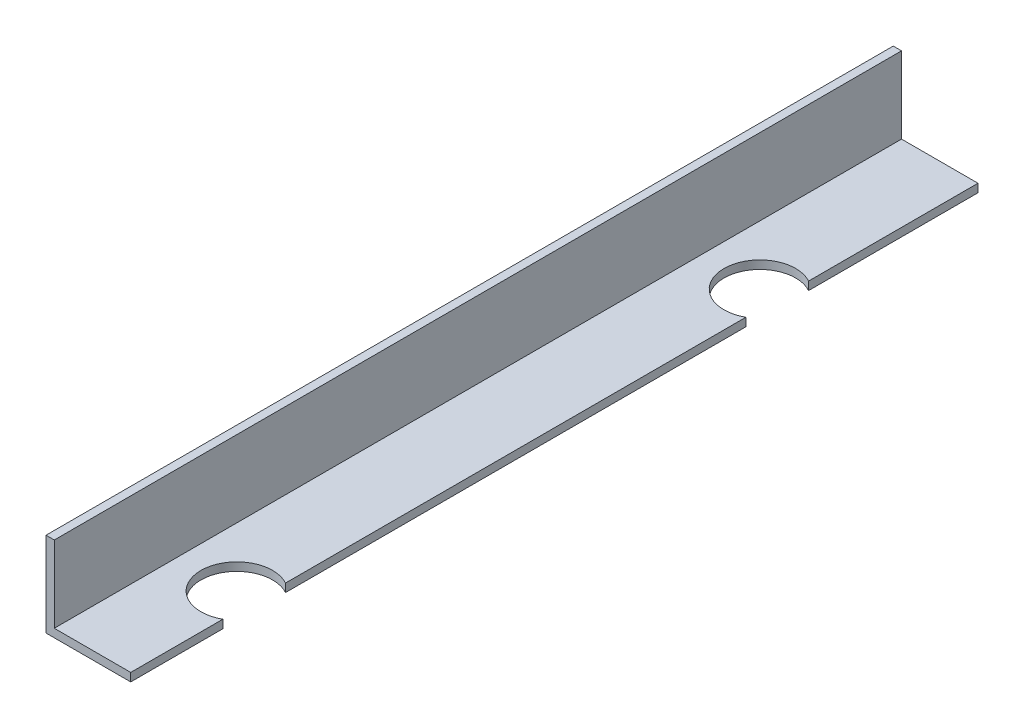
ISO-10303-21;
HEADER;
FILE_DESCRIPTION(('STEP AP214'),'2;1');
FILE_NAME('part.step','',(''),(''),'','','');
FILE_SCHEMA(('AUTOMOTIVE_DESIGN { 1 0 10303 214 1 1 1 1 }'));
ENDSEC;
DATA;
#1=APPLICATION_CONTEXT('core data for automotive mechanical design processes');
#2=APPLICATION_PROTOCOL_DEFINITION('international standard','automotive_design',2000,#1);
#3=PRODUCT_CONTEXT('',#1,'mechanical');
#4=PRODUCT('Part','Part','',(#3));
#5=PRODUCT_RELATED_PRODUCT_CATEGORY('part','',(#4));
#6=PRODUCT_DEFINITION_FORMATION('','',#4);
#7=PRODUCT_DEFINITION_CONTEXT('part definition',#1,'design');
#8=PRODUCT_DEFINITION('design','',#6,#7);
#9=PRODUCT_DEFINITION_SHAPE('','',#8);
#10=(LENGTH_UNIT() NAMED_UNIT(*) SI_UNIT(.MILLI.,.METRE.));
#11=(NAMED_UNIT(*) PLANE_ANGLE_UNIT() SI_UNIT($,.RADIAN.));
#12=(NAMED_UNIT(*) SI_UNIT($,.STERADIAN.) SOLID_ANGLE_UNIT());
#13=UNCERTAINTY_MEASURE_WITH_UNIT(LENGTH_MEASURE(1.E-05),#10,'distance_accuracy_value','');
#14=(GEOMETRIC_REPRESENTATION_CONTEXT(3) GLOBAL_UNCERTAINTY_ASSIGNED_CONTEXT((#13)) GLOBAL_UNIT_ASSIGNED_CONTEXT((#10,
#11,#12)) REPRESENTATION_CONTEXT('',''));
#15=CARTESIAN_POINT('',(0.,0.,0.));
#16=DIRECTION('',(0.,0.,1.));
#17=DIRECTION('',(1.,0.,0.));
#18=AXIS2_PLACEMENT_3D('',#15,#16,#17);
#19=CARTESIAN_POINT('',(65.,0.,325.));
#20=DIRECTION('',(-1.,0.,0.));
#21=DIRECTION('',(0.,0.,1.));
#22=AXIS2_PLACEMENT_3D('',#19,#20,#21);
#23=PLANE('',#22);
#24=DIRECTION('',(0.,0.,-1.));
#25=VECTOR('',#24,1.);
#26=CARTESIAN_POINT('',(65.,0.,325.));
#27=LINE('',#26,#25);
#28=CARTESIAN_POINT('',(65.,0.,206.240418334901));
#29=VERTEX_POINT('',#28);
#30=CARTESIAN_POINT('',(65.,0.,-146.890547328554));
#31=VERTEX_POINT('',#30);
#32=EDGE_CURVE('E120',#29,#31,#27,.T.);
#33=ORIENTED_EDGE('',*,*,#32,.T.);
#34=DIRECTION('',(0.,1.,0.));
#35=VECTOR('',#34,1.);
#36=CARTESIAN_POINT('',(65.,-3.64999999999981,-146.890547328554));
#37=LINE('',#36,#35);
#38=CARTESIAN_POINT('',(65.,6.35000000000019,-146.890547328554));
#39=VERTEX_POINT('',#38);
#40=EDGE_CURVE('E110',#31,#39,#37,.T.);
#41=ORIENTED_EDGE('',*,*,#40,.T.);
#42=DIRECTION('',(0.,0.,-1.));
#43=VECTOR('',#42,1.);
#44=CARTESIAN_POINT('',(65.,6.35,325.));
#45=LINE('',#44,#43);
#46=CARTESIAN_POINT('',(65.,6.35,206.240418334901));
#47=VERTEX_POINT('',#46);
#48=EDGE_CURVE('E118',#47,#39,#45,.T.);
#49=ORIENTED_EDGE('',*,*,#48,.F.);
#50=DIRECTION('',(0.,1.,0.));
#51=VECTOR('',#50,1.);
#52=CARTESIAN_POINT('',(65.,-3.65000000000015,206.240418334901));
#53=LINE('',#52,#51);
#54=EDGE_CURVE('E57',#47,#29,#53,.F.);
#55=ORIENTED_EDGE('',*,*,#54,.T.);
#56=EDGE_LOOP('',(#33,#41,#49,#55));
#57=FACE_BOUND('',#56,.T.);
#58=ADVANCED_FACE('F35',(#57),#23,.F.);
#59=CARTESIAN_POINT('',(65.,0.,325.));
#60=VERTEX_POINT('',#59);
#61=CARTESIAN_POINT('',(65.,0.,254.339777591017));
#62=VERTEX_POINT('',#61);
#63=EDGE_CURVE('E133',#60,#62,#27,.T.);
#64=ORIENTED_EDGE('',*,*,#63,.T.);
#65=DIRECTION('',(0.,1.,0.));
#66=VECTOR('',#65,1.);
#67=CARTESIAN_POINT('',(65.,-3.65000000000015,254.339777591017));
#68=LINE('',#67,#66);
#69=CARTESIAN_POINT('',(65.,6.34999999999985,254.339777591017));
#70=VERTEX_POINT('',#69);
#71=EDGE_CURVE('E159',#62,#70,#68,.T.);
#72=ORIENTED_EDGE('',*,*,#71,.T.);
#73=CARTESIAN_POINT('',(65.,6.35,325.));
#74=VERTEX_POINT('',#73);
#75=EDGE_CURVE('E125',#74,#70,#45,.T.);
#76=ORIENTED_EDGE('',*,*,#75,.F.);
#77=DIRECTION('',(0.,1.,0.));
#78=VECTOR('',#77,1.);
#79=CARTESIAN_POINT('',(65.,0.,325.));
#80=LINE('',#79,#78);
#81=EDGE_CURVE('E203',#60,#74,#80,.T.);
#82=ORIENTED_EDGE('',*,*,#81,.F.);
#83=EDGE_LOOP('',(#64,#72,#76,#82));
#84=FACE_BOUND('',#83,.T.);
#85=ADVANCED_FACE('F212',(#84),#23,.F.);
#86=CARTESIAN_POINT('',(0.,0.,325.));
#87=DIRECTION('',(0.,1.,0.));
#88=DIRECTION('',(0.,0.,1.));
#89=AXIS2_PLACEMENT_3D('',#86,#87,#88);
#90=PLANE('',#89);
#91=CARTESIAN_POINT('',(65.,0.,-195.026598428663));
#92=VERTEX_POINT('',#91);
#93=CARTESIAN_POINT('',(65.,0.,-325.));
#94=VERTEX_POINT('',#93);
#95=EDGE_CURVE('E128',#92,#94,#27,.T.);
#96=ORIENTED_EDGE('',*,*,#95,.F.);
#97=CARTESIAN_POINT('',(51.6966114797043,0.,-170.958572878609));
#98=DIRECTION('',(0.,1.,0.));
#99=DIRECTION('',(0.,0.,1.));
#100=AXIS2_PLACEMENT_3D('',#97,#98,#99);
#101=CIRCLE('',#100,27.5);
#102=EDGE_CURVE('E121',#92,#31,#101,.T.);
#103=ORIENTED_EDGE('',*,*,#102,.T.);
#104=ORIENTED_EDGE('',*,*,#32,.F.);
#105=CARTESIAN_POINT('',(51.6634745983908,0.,230.290097962959));
#106=DIRECTION('',(0.,1.,0.));
#107=DIRECTION('',(0.,0.,1.));
#108=AXIS2_PLACEMENT_3D('',#105,#106,#107);
#109=CIRCLE('',#108,27.5);
#110=EDGE_CURVE('E161',#29,#62,#109,.T.);
#111=ORIENTED_EDGE('',*,*,#110,.T.);
#112=ORIENTED_EDGE('',*,*,#63,.F.);
#113=DIRECTION('',(1.,0.,0.));
#114=VECTOR('',#113,1.);
#115=CARTESIAN_POINT('',(0.,0.,325.));
#116=LINE('',#115,#114);
#117=CARTESIAN_POINT('',(0.,0.,325.));
#118=VERTEX_POINT('',#117);
#119=EDGE_CURVE('E174',#118,#60,#116,.T.);
#120=ORIENTED_EDGE('',*,*,#119,.F.);
#121=DIRECTION('',(0.,0.,-1.));
#122=VECTOR('',#121,1.);
#123=CARTESIAN_POINT('',(0.,0.,325.));
#124=LINE('',#123,#122);
#125=CARTESIAN_POINT('',(0.,0.,-325.));
#126=VERTEX_POINT('',#125);
#127=EDGE_CURVE('E158',#118,#126,#124,.T.);
#128=ORIENTED_EDGE('',*,*,#127,.T.);
#129=DIRECTION('',(1.,0.,0.));
#130=VECTOR('',#129,1.);
#131=CARTESIAN_POINT('',(0.,0.,-325.));
#132=LINE('',#131,#130);
#133=EDGE_CURVE('E151',#126,#94,#132,.T.);
#134=ORIENTED_EDGE('',*,*,#133,.T.);
#135=EDGE_LOOP('',(#96,#103,#104,#111,#112,#120,#128,#134));
#136=FACE_BOUND('',#135,.T.);
#137=ADVANCED_FACE('F37',(#136),#90,.F.);
#138=CARTESIAN_POINT('',(65.,6.35,-195.026598428663));
#139=VERTEX_POINT('',#138);
#140=CARTESIAN_POINT('',(65.,6.35,-325.));
#141=VERTEX_POINT('',#140);
#142=EDGE_CURVE('E126',#139,#141,#45,.T.);
#143=ORIENTED_EDGE('',*,*,#142,.F.);
#144=DIRECTION('',(0.,1.,0.));
#145=VECTOR('',#144,1.);
#146=CARTESIAN_POINT('',(65.,-3.64999999999981,-195.026598428663));
#147=LINE('',#146,#145);
#148=EDGE_CURVE('E50',#139,#92,#147,.F.);
#149=ORIENTED_EDGE('',*,*,#148,.T.);
#150=ORIENTED_EDGE('',*,*,#95,.T.);
#151=DIRECTION('',(0.,1.,0.));
#152=VECTOR('',#151,1.);
#153=CARTESIAN_POINT('',(65.,0.,-325.));
#154=LINE('',#153,#152);
#155=EDGE_CURVE('E143',#94,#141,#154,.T.);
#156=ORIENTED_EDGE('',*,*,#155,.T.);
#157=EDGE_LOOP('',(#143,#149,#150,#156));
#158=FACE_BOUND('',#157,.T.);
#159=ADVANCED_FACE('F142',(#158),#23,.F.);
#160=CARTESIAN_POINT('',(6.35,6.35,325.));
#161=DIRECTION('',(0.,-1.,0.));
#162=DIRECTION('',(0.,0.,-1.));
#163=AXIS2_PLACEMENT_3D('',#160,#161,#162);
#164=PLANE('',#163);
#165=ORIENTED_EDGE('',*,*,#48,.T.);
#166=CARTESIAN_POINT('',(51.6966114797043,6.35,-170.958572878609));
#167=DIRECTION('',(0.,-1.,0.));
#168=DIRECTION('',(0.,0.,-1.));
#169=AXIS2_PLACEMENT_3D('',#166,#167,#168);
#170=CIRCLE('',#169,27.5);
#171=EDGE_CURVE('E11',#39,#139,#170,.T.);
#172=ORIENTED_EDGE('',*,*,#171,.T.);
#173=ORIENTED_EDGE('',*,*,#142,.T.);
#174=DIRECTION('',(-1.,0.,0.));
#175=VECTOR('',#174,1.);
#176=CARTESIAN_POINT('',(6.35,6.35,-325.));
#177=LINE('',#176,#175);
#178=CARTESIAN_POINT('',(6.35,6.35,-325.));
#179=VERTEX_POINT('',#178);
#180=EDGE_CURVE('E153',#141,#179,#177,.T.);
#181=ORIENTED_EDGE('',*,*,#180,.T.);
#182=DIRECTION('',(0.,0.,-1.));
#183=VECTOR('',#182,1.);
#184=CARTESIAN_POINT('',(6.35,6.35,325.));
#185=LINE('',#184,#183);
#186=CARTESIAN_POINT('',(6.35,6.35,325.));
#187=VERTEX_POINT('',#186);
#188=EDGE_CURVE('E129',#187,#179,#185,.T.);
#189=ORIENTED_EDGE('',*,*,#188,.F.);
#190=DIRECTION('',(-1.,0.,0.));
#191=VECTOR('',#190,1.);
#192=CARTESIAN_POINT('',(6.35,6.35,325.));
#193=LINE('',#192,#191);
#194=EDGE_CURVE('E199',#74,#187,#193,.T.);
#195=ORIENTED_EDGE('',*,*,#194,.F.);
#196=ORIENTED_EDGE('',*,*,#75,.T.);
#197=CARTESIAN_POINT('',(51.6634745983908,6.35,230.290097962959));
#198=DIRECTION('',(0.,-1.,0.));
#199=DIRECTION('',(0.,0.,-1.));
#200=AXIS2_PLACEMENT_3D('',#197,#198,#199);
#201=CIRCLE('',#200,27.5);
#202=EDGE_CURVE('E43',#70,#47,#201,.T.);
#203=ORIENTED_EDGE('',*,*,#202,.T.);
#204=EDGE_LOOP('',(#165,#172,#173,#181,#189,#195,#196,#203));
#205=FACE_BOUND('',#204,.T.);
#206=ADVANCED_FACE('F123',(#205),#164,.F.);
#207=CARTESIAN_POINT('',(6.35,6.35,325.));
#208=DIRECTION('',(-1.,0.,0.));
#209=DIRECTION('',(0.,0.,1.));
#210=AXIS2_PLACEMENT_3D('',#207,#208,#209);
#211=PLANE('',#210);
#212=DIRECTION('',(0.,1.,0.));
#213=VECTOR('',#212,1.);
#214=CARTESIAN_POINT('',(6.35,6.35,-325.));
#215=LINE('',#214,#213);
#216=CARTESIAN_POINT('',(6.35,65.,-325.));
#217=VERTEX_POINT('',#216);
#218=EDGE_CURVE('E168',#179,#217,#215,.T.);
#219=ORIENTED_EDGE('',*,*,#218,.T.);
#220=DIRECTION('',(0.,0.,-1.));
#221=VECTOR('',#220,1.);
#222=CARTESIAN_POINT('',(6.35,65.,325.));
#223=LINE('',#222,#221);
#224=CARTESIAN_POINT('',(6.35,65.,325.));
#225=VERTEX_POINT('',#224);
#226=EDGE_CURVE('E178',#225,#217,#223,.T.);
#227=ORIENTED_EDGE('',*,*,#226,.F.);
#228=DIRECTION('',(0.,1.,0.));
#229=VECTOR('',#228,1.);
#230=CARTESIAN_POINT('',(6.35,6.35,325.));
#231=LINE('',#230,#229);
#232=EDGE_CURVE('E189',#187,#225,#231,.T.);
#233=ORIENTED_EDGE('',*,*,#232,.F.);
#234=ORIENTED_EDGE('',*,*,#188,.T.);
#235=EDGE_LOOP('',(#219,#227,#233,#234));
#236=FACE_BOUND('',#235,.T.);
#237=ADVANCED_FACE('F188',(#236),#211,.F.);
#238=CARTESIAN_POINT('',(0.,65.,325.));
#239=DIRECTION('',(0.,-1.,0.));
#240=DIRECTION('',(0.,0.,-1.));
#241=AXIS2_PLACEMENT_3D('',#238,#239,#240);
#242=PLANE('',#241);
#243=DIRECTION('',(-1.,0.,0.));
#244=VECTOR('',#243,1.);
#245=CARTESIAN_POINT('',(0.,65.,-325.));
#246=LINE('',#245,#244);
#247=CARTESIAN_POINT('',(0.,65.,-325.));
#248=VERTEX_POINT('',#247);
#249=EDGE_CURVE('E170',#217,#248,#246,.T.);
#250=ORIENTED_EDGE('',*,*,#249,.T.);
#251=DIRECTION('',(0.,0.,-1.));
#252=VECTOR('',#251,1.);
#253=CARTESIAN_POINT('',(0.,65.,325.));
#254=LINE('',#253,#252);
#255=CARTESIAN_POINT('',(0.,65.,325.));
#256=VERTEX_POINT('',#255);
#257=EDGE_CURVE('E176',#256,#248,#254,.T.);
#258=ORIENTED_EDGE('',*,*,#257,.F.);
#259=DIRECTION('',(-1.,0.,0.));
#260=VECTOR('',#259,1.);
#261=CARTESIAN_POINT('',(0.,65.,325.));
#262=LINE('',#261,#260);
#263=EDGE_CURVE('E198',#225,#256,#262,.T.);
#264=ORIENTED_EDGE('',*,*,#263,.F.);
#265=ORIENTED_EDGE('',*,*,#226,.T.);
#266=EDGE_LOOP('',(#250,#258,#264,#265));
#267=FACE_BOUND('',#266,.T.);
#268=ADVANCED_FACE('F192',(#267),#242,.F.);
#269=CARTESIAN_POINT('',(0.,0.,325.));
#270=DIRECTION('',(1.,0.,0.));
#271=DIRECTION('',(0.,0.,-1.));
#272=AXIS2_PLACEMENT_3D('',#269,#270,#271);
#273=PLANE('',#272);
#274=DIRECTION('',(0.,-1.,0.));
#275=VECTOR('',#274,1.);
#276=CARTESIAN_POINT('',(0.,0.,-325.));
#277=LINE('',#276,#275);
#278=EDGE_CURVE('E172',#248,#126,#277,.T.);
#279=ORIENTED_EDGE('',*,*,#278,.T.);
#280=ORIENTED_EDGE('',*,*,#127,.F.);
#281=DIRECTION('',(0.,-1.,0.));
#282=VECTOR('',#281,1.);
#283=CARTESIAN_POINT('',(0.,0.,325.));
#284=LINE('',#283,#282);
#285=EDGE_CURVE('E164',#256,#118,#284,.T.);
#286=ORIENTED_EDGE('',*,*,#285,.F.);
#287=ORIENTED_EDGE('',*,*,#257,.T.);
#288=EDGE_LOOP('',(#279,#280,#286,#287));
#289=FACE_BOUND('',#288,.T.);
#290=ADVANCED_FACE('F195',(#289),#273,.F.);
#291=CARTESIAN_POINT('',(0.,0.,325.));
#292=DIRECTION('',(0.,0.,1.));
#293=DIRECTION('',(1.,0.,0.));
#294=AXIS2_PLACEMENT_3D('',#291,#292,#293);
#295=PLANE('',#294);
#296=ORIENTED_EDGE('',*,*,#119,.T.);
#297=ORIENTED_EDGE('',*,*,#81,.T.);
#298=ORIENTED_EDGE('',*,*,#194,.T.);
#299=ORIENTED_EDGE('',*,*,#232,.T.);
#300=ORIENTED_EDGE('',*,*,#263,.T.);
#301=ORIENTED_EDGE('',*,*,#285,.T.);
#302=EDGE_LOOP('',(#296,#297,#298,#299,#300,#301));
#303=FACE_BOUND('',#302,.T.);
#304=ADVANCED_FACE('F213',(#303),#295,.T.);
#305=CARTESIAN_POINT('',(0.,0.,-325.));
#306=DIRECTION('',(0.,0.,1.));
#307=DIRECTION('',(1.,0.,0.));
#308=AXIS2_PLACEMENT_3D('',#305,#306,#307);
#309=PLANE('',#308);
#310=ORIENTED_EDGE('',*,*,#133,.F.);
#311=ORIENTED_EDGE('',*,*,#278,.F.);
#312=ORIENTED_EDGE('',*,*,#249,.F.);
#313=ORIENTED_EDGE('',*,*,#218,.F.);
#314=ORIENTED_EDGE('',*,*,#180,.F.);
#315=ORIENTED_EDGE('',*,*,#155,.F.);
#316=EDGE_LOOP('',(#310,#311,#312,#313,#314,#315));
#317=FACE_BOUND('',#316,.T.);
#318=ADVANCED_FACE('F149',(#317),#309,.F.);
#319=CARTESIAN_POINT('',(51.6634745983908,-3.65000000000015,230.290097962959));
#320=DIRECTION('',(0.,1.,0.));
#321=DIRECTION('',(0.,0.,1.));
#322=AXIS2_PLACEMENT_3D('',#319,#320,#321);
#323=CYLINDRICAL_SURFACE('',#322,27.5);
#324=ORIENTED_EDGE('',*,*,#110,.F.);
#325=ORIENTED_EDGE('',*,*,#54,.F.);
#326=ORIENTED_EDGE('',*,*,#202,.F.);
#327=ORIENTED_EDGE('',*,*,#71,.F.);
#328=EDGE_LOOP('',(#324,#325,#326,#327));
#329=FACE_BOUND('',#328,.T.);
#330=ADVANCED_FACE('F210',(#329),#323,.F.);
#331=CARTESIAN_POINT('',(51.6966114797043,-3.64999999999981,-170.958572878609));
#332=DIRECTION('',(0.,1.,0.));
#333=DIRECTION('',(0.,0.,1.));
#334=AXIS2_PLACEMENT_3D('',#331,#332,#333);
#335=CYLINDRICAL_SURFACE('',#334,27.5);
#336=ORIENTED_EDGE('',*,*,#102,.F.);
#337=ORIENTED_EDGE('',*,*,#148,.F.);
#338=ORIENTED_EDGE('',*,*,#171,.F.);
#339=ORIENTED_EDGE('',*,*,#40,.F.);
#340=EDGE_LOOP('',(#336,#337,#338,#339));
#341=FACE_BOUND('',#340,.T.);
#342=ADVANCED_FACE('F109',(#341),#335,.F.);
#343=CLOSED_SHELL('',(#58,#85,#137,#159,#206,#237,#268,#290,#304,#318,#330,#342));
#344=MANIFOLD_SOLID_BREP('B2',#343);
#345=ADVANCED_BREP_SHAPE_REPRESENTATION('',(#18,#344),#14);
#346=SHAPE_DEFINITION_REPRESENTATION(#9,#345);
ENDSEC;
END-ISO-10303-21;
